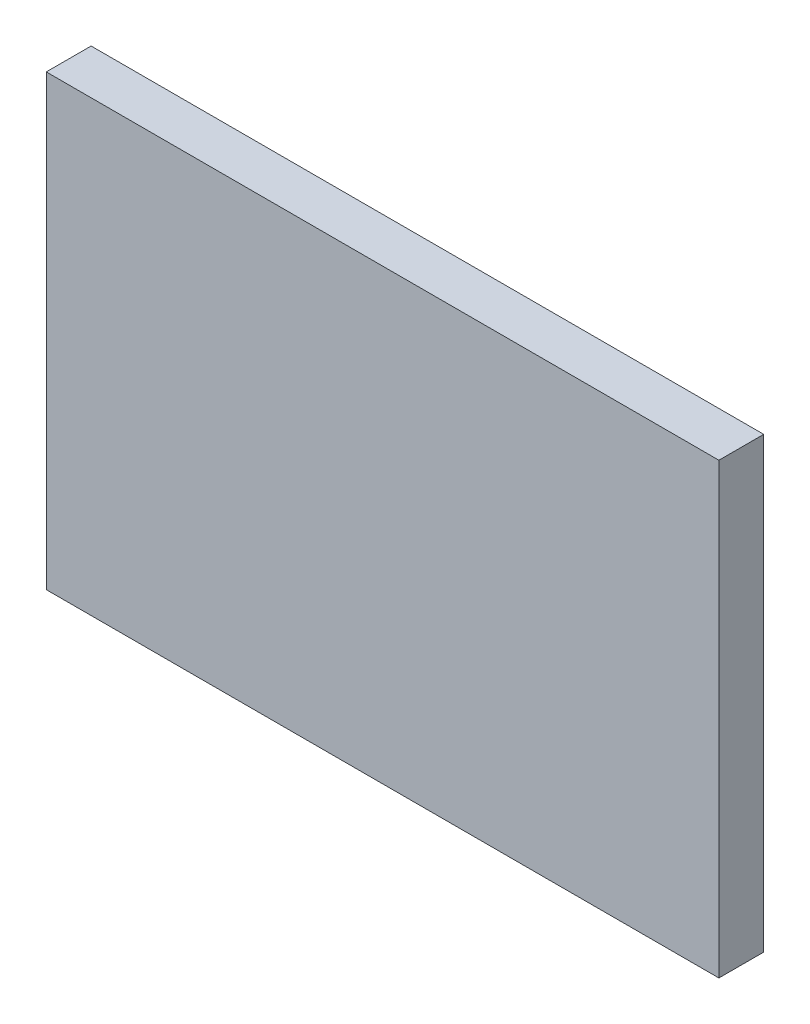
ISO-10303-21;
HEADER;
FILE_DESCRIPTION(('STEP AP214'),'2;1');
FILE_NAME('part.step','',(''),(''),'','','');
FILE_SCHEMA(('AUTOMOTIVE_DESIGN { 1 0 10303 214 1 1 1 1 }'));
ENDSEC;
DATA;
#1=APPLICATION_CONTEXT('core data for automotive mechanical design processes');
#2=APPLICATION_PROTOCOL_DEFINITION('international standard','automotive_design',2000,#1);
#3=PRODUCT_CONTEXT('',#1,'mechanical');
#4=PRODUCT('Part','Part','',(#3));
#5=PRODUCT_RELATED_PRODUCT_CATEGORY('part','',(#4));
#6=PRODUCT_DEFINITION_FORMATION('','',#4);
#7=PRODUCT_DEFINITION_CONTEXT('part definition',#1,'design');
#8=PRODUCT_DEFINITION('design','',#6,#7);
#9=PRODUCT_DEFINITION_SHAPE('','',#8);
#10=(LENGTH_UNIT() NAMED_UNIT(*) SI_UNIT(.MILLI.,.METRE.));
#11=(NAMED_UNIT(*) PLANE_ANGLE_UNIT() SI_UNIT($,.RADIAN.));
#12=(NAMED_UNIT(*) SI_UNIT($,.STERADIAN.) SOLID_ANGLE_UNIT());
#13=UNCERTAINTY_MEASURE_WITH_UNIT(LENGTH_MEASURE(1.E-05),#10,'distance_accuracy_value','');
#14=(GEOMETRIC_REPRESENTATION_CONTEXT(3) GLOBAL_UNCERTAINTY_ASSIGNED_CONTEXT((#13)) GLOBAL_UNIT_ASSIGNED_CONTEXT((#10,
#11,#12)) REPRESENTATION_CONTEXT('',''));
#15=CARTESIAN_POINT('',(0.,0.,0.));
#16=DIRECTION('',(0.,0.,1.));
#17=DIRECTION('',(1.,0.,0.));
#18=AXIS2_PLACEMENT_3D('',#15,#16,#17);
#19=CARTESIAN_POINT('',(0.,0.,2.));
#20=DIRECTION('',(1.,0.,0.));
#21=DIRECTION('',(0.,0.,-1.));
#22=AXIS2_PLACEMENT_3D('',#19,#20,#21);
#23=PLANE('',#22);
#24=DIRECTION('',(0.,-1.,0.));
#25=VECTOR('',#24,1.);
#26=CARTESIAN_POINT('',(0.,0.,0.));
#27=LINE('',#26,#25);
#28=CARTESIAN_POINT('',(0.,20.,0.));
#29=VERTEX_POINT('',#28);
#30=CARTESIAN_POINT('',(0.,0.,0.));
#31=VERTEX_POINT('',#30);
#32=EDGE_CURVE('E96',#29,#31,#27,.T.);
#33=ORIENTED_EDGE('',*,*,#32,.T.);
#34=DIRECTION('',(0.,0.,-1.));
#35=VECTOR('',#34,1.);
#36=CARTESIAN_POINT('',(0.,0.,2.));
#37=LINE('',#36,#35);
#38=CARTESIAN_POINT('',(0.,0.,2.));
#39=VERTEX_POINT('',#38);
#40=EDGE_CURVE('E11',#39,#31,#37,.T.);
#41=ORIENTED_EDGE('',*,*,#40,.F.);
#42=DIRECTION('',(0.,-1.,0.));
#43=VECTOR('',#42,1.);
#44=CARTESIAN_POINT('',(0.,0.,2.));
#45=LINE('',#44,#43);
#46=CARTESIAN_POINT('',(0.,20.,2.));
#47=VERTEX_POINT('',#46);
#48=EDGE_CURVE('E84',#47,#39,#45,.T.);
#49=ORIENTED_EDGE('',*,*,#48,.F.);
#50=DIRECTION('',(0.,0.,-1.));
#51=VECTOR('',#50,1.);
#52=CARTESIAN_POINT('',(0.,20.,2.));
#53=LINE('',#52,#51);
#54=EDGE_CURVE('E92',#47,#29,#53,.T.);
#55=ORIENTED_EDGE('',*,*,#54,.T.);
#56=EDGE_LOOP('',(#33,#41,#49,#55));
#57=FACE_BOUND('',#56,.T.);
#58=ADVANCED_FACE('F33',(#57),#23,.F.);
#59=CARTESIAN_POINT('',(0.,0.,2.));
#60=DIRECTION('',(0.,1.,0.));
#61=DIRECTION('',(0.,0.,1.));
#62=AXIS2_PLACEMENT_3D('',#59,#60,#61);
#63=PLANE('',#62);
#64=DIRECTION('',(1.,0.,0.));
#65=VECTOR('',#64,1.);
#66=CARTESIAN_POINT('',(0.,0.,0.));
#67=LINE('',#66,#65);
#68=CARTESIAN_POINT('',(30.,0.,0.));
#69=VERTEX_POINT('',#68);
#70=EDGE_CURVE('E88',#31,#69,#67,.T.);
#71=ORIENTED_EDGE('',*,*,#70,.T.);
#72=DIRECTION('',(0.,0.,-1.));
#73=VECTOR('',#72,1.);
#74=CARTESIAN_POINT('',(30.,0.,2.));
#75=LINE('',#74,#73);
#76=CARTESIAN_POINT('',(30.,0.,2.));
#77=VERTEX_POINT('',#76);
#78=EDGE_CURVE('E41',#77,#69,#75,.T.);
#79=ORIENTED_EDGE('',*,*,#78,.F.);
#80=DIRECTION('',(1.,0.,0.));
#81=VECTOR('',#80,1.);
#82=CARTESIAN_POINT('',(0.,0.,2.));
#83=LINE('',#82,#81);
#84=EDGE_CURVE('E79',#39,#77,#83,.T.);
#85=ORIENTED_EDGE('',*,*,#84,.F.);
#86=ORIENTED_EDGE('',*,*,#40,.T.);
#87=EDGE_LOOP('',(#71,#79,#85,#86));
#88=FACE_BOUND('',#87,.T.);
#89=ADVANCED_FACE('F87',(#88),#63,.F.);
#90=CARTESIAN_POINT('',(30.,0.,2.));
#91=DIRECTION('',(-1.,0.,0.));
#92=DIRECTION('',(0.,0.,1.));
#93=AXIS2_PLACEMENT_3D('',#90,#91,#92);
#94=PLANE('',#93);
#95=DIRECTION('',(0.,1.,0.));
#96=VECTOR('',#95,1.);
#97=CARTESIAN_POINT('',(30.,0.,0.));
#98=LINE('',#97,#96);
#99=CARTESIAN_POINT('',(30.,20.,0.));
#100=VERTEX_POINT('',#99);
#101=EDGE_CURVE('E66',#69,#100,#98,.T.);
#102=ORIENTED_EDGE('',*,*,#101,.T.);
#103=DIRECTION('',(0.,0.,-1.));
#104=VECTOR('',#103,1.);
#105=CARTESIAN_POINT('',(30.,20.,2.));
#106=LINE('',#105,#104);
#107=CARTESIAN_POINT('',(30.,20.,2.));
#108=VERTEX_POINT('',#107);
#109=EDGE_CURVE('E89',#108,#100,#106,.T.);
#110=ORIENTED_EDGE('',*,*,#109,.F.);
#111=DIRECTION('',(0.,1.,0.));
#112=VECTOR('',#111,1.);
#113=CARTESIAN_POINT('',(30.,0.,2.));
#114=LINE('',#113,#112);
#115=EDGE_CURVE('E82',#77,#108,#114,.T.);
#116=ORIENTED_EDGE('',*,*,#115,.F.);
#117=ORIENTED_EDGE('',*,*,#78,.T.);
#118=EDGE_LOOP('',(#102,#110,#116,#117));
#119=FACE_BOUND('',#118,.T.);
#120=ADVANCED_FACE('F90',(#119),#94,.F.);
#121=CARTESIAN_POINT('',(0.,20.,2.));
#122=DIRECTION('',(0.,-1.,0.));
#123=DIRECTION('',(0.,0.,-1.));
#124=AXIS2_PLACEMENT_3D('',#121,#122,#123);
#125=PLANE('',#124);
#126=DIRECTION('',(-1.,0.,0.));
#127=VECTOR('',#126,1.);
#128=CARTESIAN_POINT('',(0.,20.,0.));
#129=LINE('',#128,#127);
#130=EDGE_CURVE('E72',#100,#29,#129,.T.);
#131=ORIENTED_EDGE('',*,*,#130,.T.);
#132=ORIENTED_EDGE('',*,*,#54,.F.);
#133=DIRECTION('',(-1.,0.,0.));
#134=VECTOR('',#133,1.);
#135=CARTESIAN_POINT('',(0.,20.,2.));
#136=LINE('',#135,#134);
#137=EDGE_CURVE('E49',#108,#47,#136,.T.);
#138=ORIENTED_EDGE('',*,*,#137,.F.);
#139=ORIENTED_EDGE('',*,*,#109,.T.);
#140=EDGE_LOOP('',(#131,#132,#138,#139));
#141=FACE_BOUND('',#140,.T.);
#142=ADVANCED_FACE('F103',(#141),#125,.F.);
#143=CARTESIAN_POINT('',(0.,0.,2.));
#144=DIRECTION('',(0.,0.,-1.));
#145=DIRECTION('',(-1.,0.,0.));
#146=AXIS2_PLACEMENT_3D('',#143,#144,#145);
#147=PLANE('',#146);
#148=ORIENTED_EDGE('',*,*,#48,.T.);
#149=ORIENTED_EDGE('',*,*,#84,.T.);
#150=ORIENTED_EDGE('',*,*,#115,.T.);
#151=ORIENTED_EDGE('',*,*,#137,.T.);
#152=EDGE_LOOP('',(#148,#149,#150,#151));
#153=FACE_BOUND('',#152,.T.);
#154=ADVANCED_FACE('F80',(#153),#147,.F.);
#155=CARTESIAN_POINT('',(0.,0.,0.));
#156=DIRECTION('',(0.,0.,-1.));
#157=DIRECTION('',(-1.,0.,0.));
#158=AXIS2_PLACEMENT_3D('',#155,#156,#157);
#159=PLANE('',#158);
#160=ORIENTED_EDGE('',*,*,#32,.F.);
#161=ORIENTED_EDGE('',*,*,#130,.F.);
#162=ORIENTED_EDGE('',*,*,#101,.F.);
#163=ORIENTED_EDGE('',*,*,#70,.F.);
#164=EDGE_LOOP('',(#160,#161,#162,#163));
#165=FACE_BOUND('',#164,.T.);
#166=ADVANCED_FACE('F106',(#165),#159,.T.);
#167=CLOSED_SHELL('',(#58,#89,#120,#142,#154,#166));
#168=MANIFOLD_SOLID_BREP('B2',#167);
#169=ADVANCED_BREP_SHAPE_REPRESENTATION('',(#18,#168),#14);
#170=SHAPE_DEFINITION_REPRESENTATION(#9,#169);
ENDSEC;
END-ISO-10303-21;
